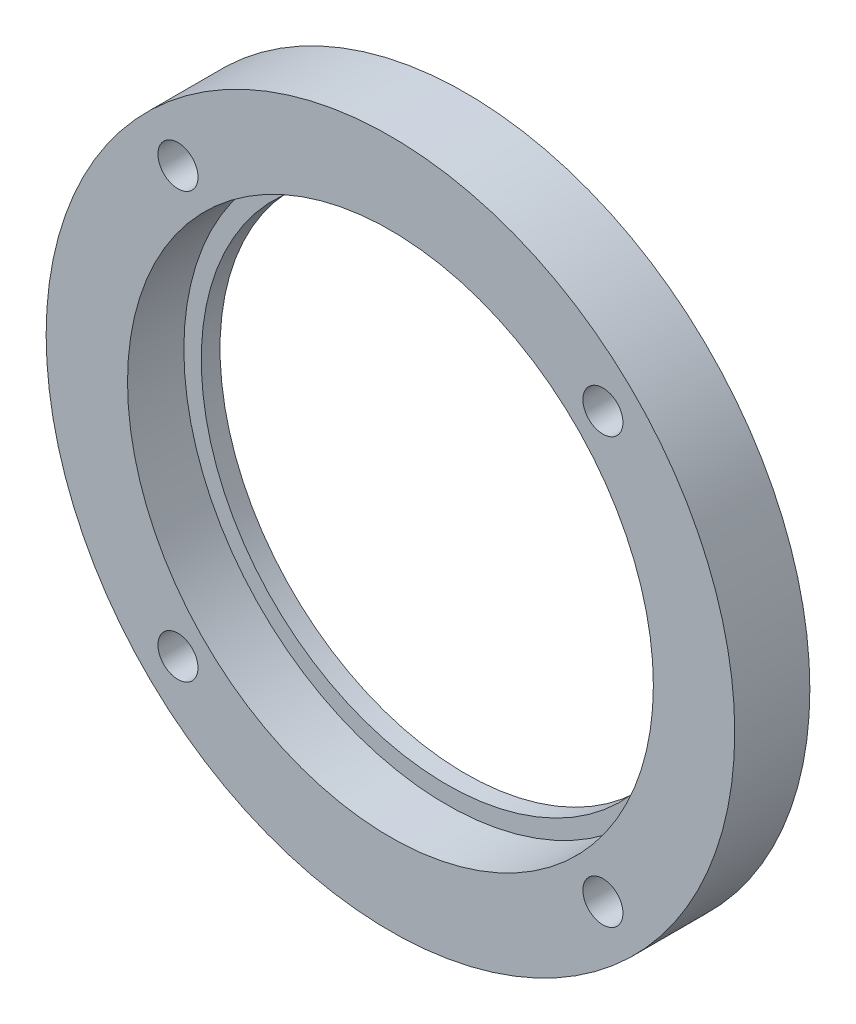
ISO-10303-21;
HEADER;
FILE_DESCRIPTION(('STEP AP214'),'2;1');
FILE_NAME('part.step','',(''),(''),'','','');
FILE_SCHEMA(('AUTOMOTIVE_DESIGN { 1 0 10303 214 1 1 1 1 }'));
ENDSEC;
DATA;
#1=APPLICATION_CONTEXT('core data for automotive mechanical design processes');
#2=APPLICATION_PROTOCOL_DEFINITION('international standard','automotive_design',2000,#1);
#3=PRODUCT_CONTEXT('',#1,'mechanical');
#4=PRODUCT('Part','Part','',(#3));
#5=PRODUCT_RELATED_PRODUCT_CATEGORY('part','',(#4));
#6=PRODUCT_DEFINITION_FORMATION('','',#4);
#7=PRODUCT_DEFINITION_CONTEXT('part definition',#1,'design');
#8=PRODUCT_DEFINITION('design','',#6,#7);
#9=PRODUCT_DEFINITION_SHAPE('','',#8);
#10=(LENGTH_UNIT() NAMED_UNIT(*) SI_UNIT(.MILLI.,.METRE.));
#11=(NAMED_UNIT(*) PLANE_ANGLE_UNIT() SI_UNIT($,.RADIAN.));
#12=(NAMED_UNIT(*) SI_UNIT($,.STERADIAN.) SOLID_ANGLE_UNIT());
#13=UNCERTAINTY_MEASURE_WITH_UNIT(LENGTH_MEASURE(1.E-05),#10,'distance_accuracy_value','');
#14=(GEOMETRIC_REPRESENTATION_CONTEXT(3) GLOBAL_UNCERTAINTY_ASSIGNED_CONTEXT((#13)) GLOBAL_UNIT_ASSIGNED_CONTEXT((#10,
#11,#12)) REPRESENTATION_CONTEXT('',''));
#15=CARTESIAN_POINT('',(0.,0.,0.));
#16=DIRECTION('',(0.,0.,1.));
#17=DIRECTION('',(1.,0.,0.));
#18=AXIS2_PLACEMENT_3D('',#15,#16,#17);
#19=CARTESIAN_POINT('',(0.,0.,6.));
#20=DIRECTION('',(0.,0.,-1.));
#21=DIRECTION('',(-1.,0.,0.));
#22=AXIS2_PLACEMENT_3D('',#19,#20,#21);
#23=CYLINDRICAL_SURFACE('',#22,21.);
#24=CARTESIAN_POINT('',(0.,0.,1.5));
#25=DIRECTION('',(0.,0.,1.));
#26=DIRECTION('',(1.,0.,0.));
#27=AXIS2_PLACEMENT_3D('',#24,#25,#26);
#28=CIRCLE('',#27,21.);
#29=CARTESIAN_POINT('',(21.,0.,1.5));
#30=VERTEX_POINT('',#29);
#31=EDGE_CURVE('E10',#30,#30,#28,.T.);
#32=ORIENTED_EDGE('',*,*,#31,.F.);
#33=EDGE_LOOP('',(#32));
#34=FACE_BOUND('',#33,.T.);
#35=CARTESIAN_POINT('',(0.,0.,6.));
#36=DIRECTION('',(0.,0.,1.));
#37=DIRECTION('',(1.,0.,0.));
#38=AXIS2_PLACEMENT_3D('',#35,#36,#37);
#39=CIRCLE('',#38,21.);
#40=CARTESIAN_POINT('',(21.,0.,6.));
#41=VERTEX_POINT('',#40);
#42=EDGE_CURVE('E42',#41,#41,#39,.T.);
#43=ORIENTED_EDGE('',*,*,#42,.T.);
#44=EDGE_LOOP('',(#43));
#45=FACE_BOUND('',#44,.T.);
#46=ADVANCED_FACE('F32',(#34,#45),#23,.F.);
#47=CARTESIAN_POINT('',(0.,0.,6.));
#48=DIRECTION('',(0.,0.,-1.));
#49=DIRECTION('',(-1.,0.,0.));
#50=AXIS2_PLACEMENT_3D('',#47,#48,#49);
#51=CYLINDRICAL_SURFACE('',#50,27.5);
#52=CARTESIAN_POINT('',(0.,0.,6.));
#53=DIRECTION('',(0.,0.,1.));
#54=DIRECTION('',(1.,0.,0.));
#55=AXIS2_PLACEMENT_3D('',#52,#53,#54);
#56=CIRCLE('',#55,27.5);
#57=CARTESIAN_POINT('',(27.5,0.,6.));
#58=VERTEX_POINT('',#57);
#59=EDGE_CURVE('E38',#58,#58,#56,.T.);
#60=ORIENTED_EDGE('',*,*,#59,.F.);
#61=EDGE_LOOP('',(#60));
#62=FACE_BOUND('',#61,.T.);
#63=CARTESIAN_POINT('',(0.,0.,0.));
#64=DIRECTION('',(0.,0.,1.));
#65=DIRECTION('',(1.,0.,0.));
#66=AXIS2_PLACEMENT_3D('',#63,#64,#65);
#67=CIRCLE('',#66,27.5);
#68=CARTESIAN_POINT('',(27.5,0.,0.));
#69=VERTEX_POINT('',#68);
#70=EDGE_CURVE('E47',#69,#69,#67,.T.);
#71=ORIENTED_EDGE('',*,*,#70,.T.);
#72=EDGE_LOOP('',(#71));
#73=FACE_BOUND('',#72,.T.);
#74=ADVANCED_FACE('F126',(#62,#73),#51,.T.);
#75=CARTESIAN_POINT('',(0.,0.,6.));
#76=DIRECTION('',(0.,0.,1.));
#77=DIRECTION('',(1.,0.,0.));
#78=AXIS2_PLACEMENT_3D('',#75,#76,#77);
#79=PLANE('',#78);
#80=CARTESIAN_POINT('',(16.9705627484771,16.9705627484771,6.00000000000001));
#81=DIRECTION('',(0.,0.,-1.));
#82=DIRECTION('',(-1.,0.,0.));
#83=AXIS2_PLACEMENT_3D('',#80,#81,#82);
#84=CIRCLE('',#83,1.59999999999999);
#85=CARTESIAN_POINT('',(15.3705627484772,16.9705627484771,6.00000000000001));
#86=VERTEX_POINT('',#85);
#87=EDGE_CURVE('E88',#86,#86,#84,.T.);
#88=ORIENTED_EDGE('',*,*,#87,.T.);
#89=EDGE_LOOP('',(#88));
#90=FACE_BOUND('',#89,.T.);
#91=CARTESIAN_POINT('',(-16.9705627484771,16.9705627484771,6.00000000000001));
#92=DIRECTION('',(0.,0.,-1.));
#93=DIRECTION('',(-1.,0.,0.));
#94=AXIS2_PLACEMENT_3D('',#91,#92,#93);
#95=CIRCLE('',#94,1.59999999999999);
#96=CARTESIAN_POINT('',(-18.5705627484771,16.9705627484771,6.00000000000001));
#97=VERTEX_POINT('',#96);
#98=EDGE_CURVE('E79',#97,#97,#95,.T.);
#99=ORIENTED_EDGE('',*,*,#98,.T.);
#100=EDGE_LOOP('',(#99));
#101=FACE_BOUND('',#100,.T.);
#102=CARTESIAN_POINT('',(-16.9705627484771,-16.9705627484771,6.00000000000001));
#103=DIRECTION('',(0.,0.,-1.));
#104=DIRECTION('',(-1.,0.,0.));
#105=AXIS2_PLACEMENT_3D('',#102,#103,#104);
#106=CIRCLE('',#105,1.59999999999999);
#107=CARTESIAN_POINT('',(-18.5705627484771,-16.9705627484771,6.00000000000001));
#108=VERTEX_POINT('',#107);
#109=EDGE_CURVE('E70',#108,#108,#106,.T.);
#110=ORIENTED_EDGE('',*,*,#109,.T.);
#111=EDGE_LOOP('',(#110));
#112=FACE_BOUND('',#111,.T.);
#113=CARTESIAN_POINT('',(16.9705627484771,-16.9705627484771,6.00000000000001));
#114=DIRECTION('',(0.,0.,-1.));
#115=DIRECTION('',(-1.,0.,0.));
#116=AXIS2_PLACEMENT_3D('',#113,#114,#115);
#117=CIRCLE('',#116,1.59999999999999);
#118=CARTESIAN_POINT('',(15.3705627484772,-16.9705627484771,6.00000000000001));
#119=VERTEX_POINT('',#118);
#120=EDGE_CURVE('E60',#119,#119,#117,.T.);
#121=ORIENTED_EDGE('',*,*,#120,.T.);
#122=EDGE_LOOP('',(#121));
#123=FACE_BOUND('',#122,.T.);
#124=ORIENTED_EDGE('',*,*,#42,.F.);
#125=EDGE_LOOP('',(#124));
#126=FACE_BOUND('',#125,.T.);
#127=ORIENTED_EDGE('',*,*,#59,.T.);
#128=EDGE_LOOP('',(#127));
#129=FACE_BOUND('',#128,.T.);
#130=ADVANCED_FACE('F104',(#90,#101,#112,#123,#126,#129),#79,.T.);
#131=CARTESIAN_POINT('',(0.,0.,0.));
#132=DIRECTION('',(0.,0.,1.));
#133=DIRECTION('',(1.,0.,0.));
#134=AXIS2_PLACEMENT_3D('',#131,#132,#133);
#135=PLANE('',#134);
#136=CARTESIAN_POINT('',(16.9705627484771,16.9705627484771,0.));
#137=DIRECTION('',(0.,0.,-1.));
#138=DIRECTION('',(-1.,0.,0.));
#139=AXIS2_PLACEMENT_3D('',#136,#137,#138);
#140=CIRCLE('',#139,3.15);
#141=CARTESIAN_POINT('',(13.8205627484771,16.9705627484771,0.));
#142=VERTEX_POINT('',#141);
#143=EDGE_CURVE('E94',#142,#142,#140,.T.);
#144=ORIENTED_EDGE('',*,*,#143,.F.);
#145=EDGE_LOOP('',(#144));
#146=FACE_BOUND('',#145,.T.);
#147=CARTESIAN_POINT('',(-16.9705627484771,16.9705627484771,0.));
#148=DIRECTION('',(0.,0.,-1.));
#149=DIRECTION('',(-1.,0.,0.));
#150=AXIS2_PLACEMENT_3D('',#147,#148,#149);
#151=CIRCLE('',#150,3.15);
#152=CARTESIAN_POINT('',(-20.1205627484771,16.9705627484771,0.));
#153=VERTEX_POINT('',#152);
#154=EDGE_CURVE('E85',#153,#153,#151,.T.);
#155=ORIENTED_EDGE('',*,*,#154,.F.);
#156=EDGE_LOOP('',(#155));
#157=FACE_BOUND('',#156,.T.);
#158=CARTESIAN_POINT('',(-16.9705627484771,-16.9705627484771,0.));
#159=DIRECTION('',(0.,0.,-1.));
#160=DIRECTION('',(-1.,0.,0.));
#161=AXIS2_PLACEMENT_3D('',#158,#159,#160);
#162=CIRCLE('',#161,3.15);
#163=CARTESIAN_POINT('',(-20.1205627484771,-16.9705627484771,0.));
#164=VERTEX_POINT('',#163);
#165=EDGE_CURVE('E76',#164,#164,#162,.T.);
#166=ORIENTED_EDGE('',*,*,#165,.F.);
#167=EDGE_LOOP('',(#166));
#168=FACE_BOUND('',#167,.T.);
#169=CARTESIAN_POINT('',(16.9705627484771,-16.9705627484771,0.));
#170=DIRECTION('',(0.,0.,-1.));
#171=DIRECTION('',(-1.,0.,0.));
#172=AXIS2_PLACEMENT_3D('',#169,#170,#171);
#173=CIRCLE('',#172,3.15);
#174=CARTESIAN_POINT('',(13.8205627484771,-16.9705627484771,0.));
#175=VERTEX_POINT('',#174);
#176=EDGE_CURVE('E67',#175,#175,#173,.T.);
#177=ORIENTED_EDGE('',*,*,#176,.F.);
#178=EDGE_LOOP('',(#177));
#179=FACE_BOUND('',#178,.T.);
#180=ORIENTED_EDGE('',*,*,#70,.F.);
#181=EDGE_LOOP('',(#180));
#182=FACE_BOUND('',#181,.T.);
#183=CARTESIAN_POINT('',(0.,0.,0.));
#184=DIRECTION('',(0.,0.,1.));
#185=DIRECTION('',(1.,0.,0.));
#186=AXIS2_PLACEMENT_3D('',#183,#184,#185);
#187=CIRCLE('',#186,19.61);
#188=CARTESIAN_POINT('',(19.61,0.,0.));
#189=VERTEX_POINT('',#188);
#190=EDGE_CURVE('E55',#189,#189,#187,.T.);
#191=ORIENTED_EDGE('',*,*,#190,.T.);
#192=EDGE_LOOP('',(#191));
#193=FACE_BOUND('',#192,.T.);
#194=ADVANCED_FACE('F100',(#146,#157,#168,#179,#182,#193),#135,.F.);
#195=CARTESIAN_POINT('',(0.,0.,1.5));
#196=DIRECTION('',(0.,0.,-1.));
#197=DIRECTION('',(-1.,0.,0.));
#198=AXIS2_PLACEMENT_3D('',#195,#196,#197);
#199=CYLINDRICAL_SURFACE('',#198,19.61);
#200=CARTESIAN_POINT('',(0.,0.,1.5));
#201=DIRECTION('',(0.,0.,1.));
#202=DIRECTION('',(1.,0.,0.));
#203=AXIS2_PLACEMENT_3D('',#200,#201,#202);
#204=CIRCLE('',#203,19.61);
#205=CARTESIAN_POINT('',(19.61,0.,1.5));
#206=VERTEX_POINT('',#205);
#207=EDGE_CURVE('E51',#206,#206,#204,.T.);
#208=ORIENTED_EDGE('',*,*,#207,.T.);
#209=EDGE_LOOP('',(#208));
#210=FACE_BOUND('',#209,.T.);
#211=ORIENTED_EDGE('',*,*,#190,.F.);
#212=EDGE_LOOP('',(#211));
#213=FACE_BOUND('',#212,.T.);
#214=ADVANCED_FACE('F103',(#210,#213),#199,.F.);
#215=CARTESIAN_POINT('',(0.,0.,1.5));
#216=DIRECTION('',(0.,0.,1.));
#217=DIRECTION('',(1.,0.,0.));
#218=AXIS2_PLACEMENT_3D('',#215,#216,#217);
#219=PLANE('',#218);
#220=ORIENTED_EDGE('',*,*,#207,.F.);
#221=EDGE_LOOP('',(#220));
#222=FACE_BOUND('',#221,.T.);
#223=ORIENTED_EDGE('',*,*,#31,.T.);
#224=EDGE_LOOP('',(#223));
#225=FACE_BOUND('',#224,.T.);
#226=ADVANCED_FACE('F116',(#222,#225),#219,.T.);
#227=CARTESIAN_POINT('',(16.9705627484771,-16.9705627484771,0.));
#228=DIRECTION('',(0.,0.,-1.));
#229=DIRECTION('',(-1.,0.,0.));
#230=AXIS2_PLACEMENT_3D('',#227,#228,#229);
#231=CYLINDRICAL_SURFACE('',#230,1.59999999999999);
#232=ORIENTED_EDGE('',*,*,#120,.F.);
#233=EDGE_LOOP('',(#232));
#234=FACE_BOUND('',#233,.T.);
#235=CARTESIAN_POINT('',(16.9705627484771,-16.9705627484771,1.55));
#236=DIRECTION('',(0.,0.,-1.));
#237=DIRECTION('',(-1.,0.,0.));
#238=AXIS2_PLACEMENT_3D('',#235,#236,#237);
#239=CIRCLE('',#238,1.6);
#240=CARTESIAN_POINT('',(15.3705627484771,-16.9705627484771,1.55));
#241=VERTEX_POINT('',#240);
#242=EDGE_CURVE('E64',#241,#241,#239,.T.);
#243=ORIENTED_EDGE('',*,*,#242,.T.);
#244=EDGE_LOOP('',(#243));
#245=FACE_BOUND('',#244,.T.);
#246=ADVANCED_FACE('F121',(#234,#245),#231,.F.);
#247=CARTESIAN_POINT('',(16.9705627484771,-16.9705627484771,0.));
#248=DIRECTION('',(0.,0.,-1.));
#249=DIRECTION('',(-1.,0.,0.));
#250=AXIS2_PLACEMENT_3D('',#247,#248,#249);
#251=CONICAL_SURFACE('',#250,3.15,0.785398163397448);
#252=ORIENTED_EDGE('',*,*,#242,.F.);
#253=EDGE_LOOP('',(#252));
#254=FACE_BOUND('',#253,.T.);
#255=ORIENTED_EDGE('',*,*,#176,.T.);
#256=EDGE_LOOP('',(#255));
#257=FACE_BOUND('',#256,.T.);
#258=ADVANCED_FACE('F149',(#254,#257),#251,.F.);
#259=CARTESIAN_POINT('',(-16.9705627484771,-16.9705627484771,0.));
#260=DIRECTION('',(0.,0.,-1.));
#261=DIRECTION('',(-1.,0.,0.));
#262=AXIS2_PLACEMENT_3D('',#259,#260,#261);
#263=CYLINDRICAL_SURFACE('',#262,1.59999999999999);
#264=ORIENTED_EDGE('',*,*,#109,.F.);
#265=EDGE_LOOP('',(#264));
#266=FACE_BOUND('',#265,.T.);
#267=CARTESIAN_POINT('',(-16.9705627484771,-16.9705627484771,1.55));
#268=DIRECTION('',(0.,0.,-1.));
#269=DIRECTION('',(-1.,0.,0.));
#270=AXIS2_PLACEMENT_3D('',#267,#268,#269);
#271=CIRCLE('',#270,1.6);
#272=CARTESIAN_POINT('',(-18.5705627484771,-16.9705627484771,1.55));
#273=VERTEX_POINT('',#272);
#274=EDGE_CURVE('E73',#273,#273,#271,.T.);
#275=ORIENTED_EDGE('',*,*,#274,.T.);
#276=EDGE_LOOP('',(#275));
#277=FACE_BOUND('',#276,.T.);
#278=ADVANCED_FACE('F155',(#266,#277),#263,.F.);
#279=CARTESIAN_POINT('',(-16.9705627484771,-16.9705627484771,0.));
#280=DIRECTION('',(0.,0.,-1.));
#281=DIRECTION('',(-1.,0.,0.));
#282=AXIS2_PLACEMENT_3D('',#279,#280,#281);
#283=CONICAL_SURFACE('',#282,3.15,0.785398163397448);
#284=ORIENTED_EDGE('',*,*,#274,.F.);
#285=EDGE_LOOP('',(#284));
#286=FACE_BOUND('',#285,.T.);
#287=ORIENTED_EDGE('',*,*,#165,.T.);
#288=EDGE_LOOP('',(#287));
#289=FACE_BOUND('',#288,.T.);
#290=ADVANCED_FACE('F160',(#286,#289),#283,.F.);
#291=CARTESIAN_POINT('',(-16.9705627484771,16.9705627484771,0.));
#292=DIRECTION('',(0.,0.,-1.));
#293=DIRECTION('',(-1.,0.,0.));
#294=AXIS2_PLACEMENT_3D('',#291,#292,#293);
#295=CYLINDRICAL_SURFACE('',#294,1.59999999999999);
#296=ORIENTED_EDGE('',*,*,#98,.F.);
#297=EDGE_LOOP('',(#296));
#298=FACE_BOUND('',#297,.T.);
#299=CARTESIAN_POINT('',(-16.9705627484771,16.9705627484771,1.55));
#300=DIRECTION('',(0.,0.,-1.));
#301=DIRECTION('',(-1.,0.,0.));
#302=AXIS2_PLACEMENT_3D('',#299,#300,#301);
#303=CIRCLE('',#302,1.6);
#304=CARTESIAN_POINT('',(-18.5705627484771,16.9705627484771,1.55));
#305=VERTEX_POINT('',#304);
#306=EDGE_CURVE('E82',#305,#305,#303,.T.);
#307=ORIENTED_EDGE('',*,*,#306,.T.);
#308=EDGE_LOOP('',(#307));
#309=FACE_BOUND('',#308,.T.);
#310=ADVANCED_FACE('F166',(#298,#309),#295,.F.);
#311=CARTESIAN_POINT('',(-16.9705627484771,16.9705627484771,0.));
#312=DIRECTION('',(0.,0.,-1.));
#313=DIRECTION('',(-1.,0.,0.));
#314=AXIS2_PLACEMENT_3D('',#311,#312,#313);
#315=CONICAL_SURFACE('',#314,3.15,0.785398163397448);
#316=ORIENTED_EDGE('',*,*,#306,.F.);
#317=EDGE_LOOP('',(#316));
#318=FACE_BOUND('',#317,.T.);
#319=ORIENTED_EDGE('',*,*,#154,.T.);
#320=EDGE_LOOP('',(#319));
#321=FACE_BOUND('',#320,.T.);
#322=ADVANCED_FACE('F170',(#318,#321),#315,.F.);
#323=CARTESIAN_POINT('',(16.9705627484771,16.9705627484771,0.));
#324=DIRECTION('',(0.,0.,-1.));
#325=DIRECTION('',(-1.,0.,0.));
#326=AXIS2_PLACEMENT_3D('',#323,#324,#325);
#327=CYLINDRICAL_SURFACE('',#326,1.59999999999999);
#328=ORIENTED_EDGE('',*,*,#87,.F.);
#329=EDGE_LOOP('',(#328));
#330=FACE_BOUND('',#329,.T.);
#331=CARTESIAN_POINT('',(16.9705627484771,16.9705627484771,1.55));
#332=DIRECTION('',(0.,0.,-1.));
#333=DIRECTION('',(-1.,0.,0.));
#334=AXIS2_PLACEMENT_3D('',#331,#332,#333);
#335=CIRCLE('',#334,1.6);
#336=CARTESIAN_POINT('',(15.3705627484771,16.9705627484771,1.55));
#337=VERTEX_POINT('',#336);
#338=EDGE_CURVE('E91',#337,#337,#335,.T.);
#339=ORIENTED_EDGE('',*,*,#338,.T.);
#340=EDGE_LOOP('',(#339));
#341=FACE_BOUND('',#340,.T.);
#342=ADVANCED_FACE('F174',(#330,#341),#327,.F.);
#343=CARTESIAN_POINT('',(16.9705627484771,16.9705627484771,0.));
#344=DIRECTION('',(0.,0.,-1.));
#345=DIRECTION('',(-1.,0.,0.));
#346=AXIS2_PLACEMENT_3D('',#343,#344,#345);
#347=CONICAL_SURFACE('',#346,3.15,0.785398163397448);
#348=ORIENTED_EDGE('',*,*,#338,.F.);
#349=EDGE_LOOP('',(#348));
#350=FACE_BOUND('',#349,.T.);
#351=ORIENTED_EDGE('',*,*,#143,.T.);
#352=EDGE_LOOP('',(#351));
#353=FACE_BOUND('',#352,.T.);
#354=ADVANCED_FACE('F98',(#350,#353),#347,.F.);
#355=CLOSED_SHELL('',(#46,#74,#130,#194,#214,#226,#246,#258,#278,#290,#310,#322,#342,#354));
#356=MANIFOLD_SOLID_BREP('B2',#355);
#357=ADVANCED_BREP_SHAPE_REPRESENTATION('',(#18,#356),#14);
#358=SHAPE_DEFINITION_REPRESENTATION(#9,#357);
ENDSEC;
END-ISO-10303-21;
